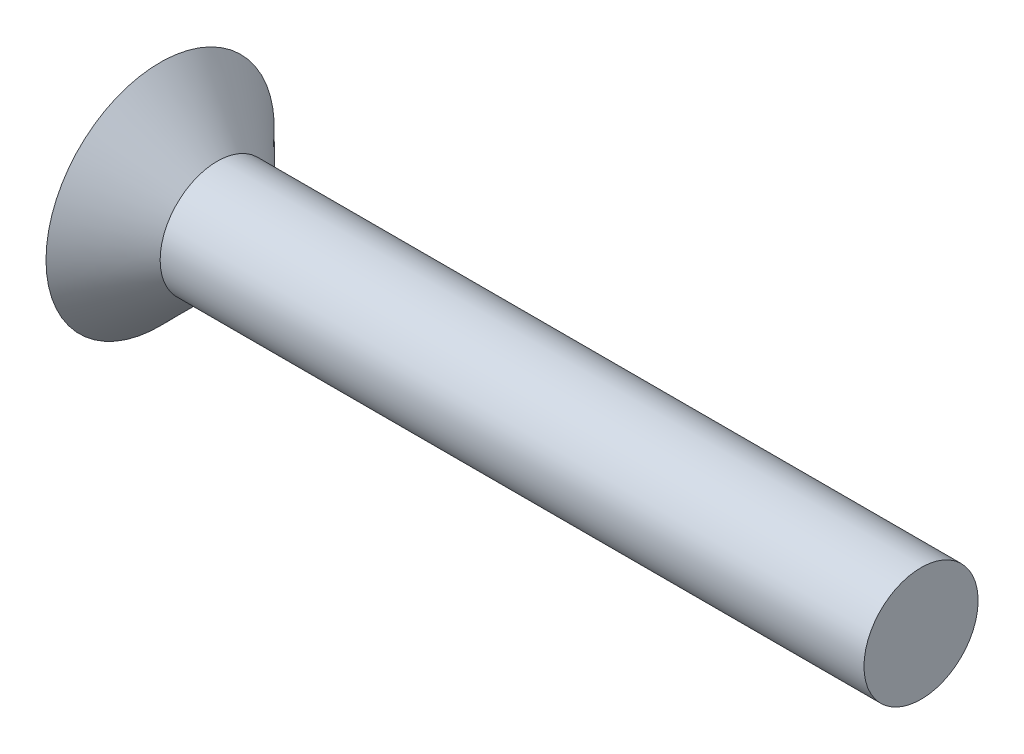
ISO-10303-21;
HEADER;
FILE_DESCRIPTION(('STEP AP214'),'2;1');
FILE_NAME('part.step','',(''),(''),'','','');
FILE_SCHEMA(('AUTOMOTIVE_DESIGN { 1 0 10303 214 1 1 1 1 }'));
ENDSEC;
DATA;
#1=APPLICATION_CONTEXT('core data for automotive mechanical design processes');
#2=APPLICATION_PROTOCOL_DEFINITION('international standard','automotive_design',2000,#1);
#3=PRODUCT_CONTEXT('',#1,'mechanical');
#4=PRODUCT('Part','Part','',(#3));
#5=PRODUCT_RELATED_PRODUCT_CATEGORY('part','',(#4));
#6=PRODUCT_DEFINITION_FORMATION('','',#4);
#7=PRODUCT_DEFINITION_CONTEXT('part definition',#1,'design');
#8=PRODUCT_DEFINITION('design','',#6,#7);
#9=PRODUCT_DEFINITION_SHAPE('','',#8);
#10=(LENGTH_UNIT() NAMED_UNIT(*) SI_UNIT(.MILLI.,.METRE.));
#11=(NAMED_UNIT(*) PLANE_ANGLE_UNIT() SI_UNIT($,.RADIAN.));
#12=(NAMED_UNIT(*) SI_UNIT($,.STERADIAN.) SOLID_ANGLE_UNIT());
#13=UNCERTAINTY_MEASURE_WITH_UNIT(LENGTH_MEASURE(1.E-05),#10,'distance_accuracy_value','');
#14=(GEOMETRIC_REPRESENTATION_CONTEXT(3) GLOBAL_UNCERTAINTY_ASSIGNED_CONTEXT((#13)) GLOBAL_UNIT_ASSIGNED_CONTEXT((#10,
#11,#12)) REPRESENTATION_CONTEXT('',''));
#15=CARTESIAN_POINT('',(0.,0.,0.));
#16=DIRECTION('',(0.,0.,1.));
#17=DIRECTION('',(1.,0.,0.));
#18=AXIS2_PLACEMENT_3D('',#15,#16,#17);
#19=CARTESIAN_POINT('',(0.,0.,0.));
#20=DIRECTION('',(-1.,0.,0.));
#21=DIRECTION('',(0.,0.,1.));
#22=AXIS2_PLACEMENT_3D('',#19,#20,#21);
#23=PLANE('',#22);
#24=DIRECTION('',(0.,0.5,-0.866025403784439));
#25=VECTOR('',#24,1.);
#26=CARTESIAN_POINT('',(0.,0.577350269189627,1.));
#27=LINE('',#26,#25);
#28=CARTESIAN_POINT('',(0.,0.577350269189627,1.));
#29=VERTEX_POINT('',#28);
#30=CARTESIAN_POINT('',(0.,1.15470053837925,0.));
#31=VERTEX_POINT('',#30);
#32=EDGE_CURVE('E54',#29,#31,#27,.T.);
#33=ORIENTED_EDGE('',*,*,#32,.F.);
#34=DIRECTION('',(0.,1.,0.));
#35=VECTOR('',#34,1.);
#36=CARTESIAN_POINT('',(0.,-0.577350269189627,1.));
#37=LINE('',#36,#35);
#38=CARTESIAN_POINT('',(0.,-0.577350269189627,1.));
#39=VERTEX_POINT('',#38);
#40=EDGE_CURVE('E137',#39,#29,#37,.T.);
#41=ORIENTED_EDGE('',*,*,#40,.F.);
#42=DIRECTION('',(0.,0.5,0.866025403784439));
#43=VECTOR('',#42,1.);
#44=CARTESIAN_POINT('',(0.,-1.15470053837925,0.));
#45=LINE('',#44,#43);
#46=CARTESIAN_POINT('',(0.,-1.15470053837925,0.));
#47=VERTEX_POINT('',#46);
#48=EDGE_CURVE('E135',#47,#39,#45,.T.);
#49=ORIENTED_EDGE('',*,*,#48,.F.);
#50=DIRECTION('',(0.,-0.5,0.866025403784438));
#51=VECTOR('',#50,1.);
#52=CARTESIAN_POINT('',(0.,-0.577350269189626,-1.));
#53=LINE('',#52,#51);
#54=CARTESIAN_POINT('',(0.,-0.577350269189626,-1.));
#55=VERTEX_POINT('',#54);
#56=EDGE_CURVE('E102',#55,#47,#53,.T.);
#57=ORIENTED_EDGE('',*,*,#56,.F.);
#58=DIRECTION('',(0.,-1.,0.));
#59=VECTOR('',#58,1.);
#60=CARTESIAN_POINT('',(0.,0.577350269189627,-1.));
#61=LINE('',#60,#59);
#62=CARTESIAN_POINT('',(0.,0.577350269189627,-1.));
#63=VERTEX_POINT('',#62);
#64=EDGE_CURVE('E131',#63,#55,#61,.T.);
#65=ORIENTED_EDGE('',*,*,#64,.F.);
#66=DIRECTION('',(0.,-0.5,-0.866025403784439));
#67=VECTOR('',#66,1.);
#68=CARTESIAN_POINT('',(0.,1.15470053837925,0.));
#69=LINE('',#68,#67);
#70=EDGE_CURVE('E128',#31,#63,#69,.T.);
#71=ORIENTED_EDGE('',*,*,#70,.F.);
#72=EDGE_LOOP('',(#33,#41,#49,#57,#65,#71));
#73=FACE_BOUND('',#72,.T.);
#74=CARTESIAN_POINT('',(0.,0.,0.));
#75=DIRECTION('',(-1.,0.,0.));
#76=DIRECTION('',(0.,0.,1.));
#77=AXIS2_PLACEMENT_3D('',#74,#75,#76);
#78=CIRCLE('',#77,3.);
#79=CARTESIAN_POINT('',(0.,0.,3.));
#80=VERTEX_POINT('',#79);
#81=EDGE_CURVE('E141',#80,#80,#78,.T.);
#82=ORIENTED_EDGE('',*,*,#81,.T.);
#83=EDGE_LOOP('',(#82));
#84=FACE_BOUND('',#83,.T.);
#85=ADVANCED_FACE('F40',(#73,#84),#23,.T.);
#86=CARTESIAN_POINT('',(20.,0.,0.));
#87=DIRECTION('',(-1.,0.,0.));
#88=DIRECTION('',(0.,0.,1.));
#89=AXIS2_PLACEMENT_3D('',#86,#87,#88);
#90=PLANE('',#89);
#91=CARTESIAN_POINT('',(20.,0.,0.));
#92=DIRECTION('',(-1.,0.,0.));
#93=DIRECTION('',(0.,0.,1.));
#94=AXIS2_PLACEMENT_3D('',#91,#92,#93);
#95=CIRCLE('',#94,1.5);
#96=CARTESIAN_POINT('',(20.,0.,1.5));
#97=VERTEX_POINT('',#96);
#98=EDGE_CURVE('E11',#97,#97,#95,.T.);
#99=ORIENTED_EDGE('',*,*,#98,.F.);
#100=EDGE_LOOP('',(#99));
#101=FACE_BOUND('',#100,.T.);
#102=ADVANCED_FACE('F156',(#101),#90,.F.);
#103=CARTESIAN_POINT('',(0.,0.,0.));
#104=DIRECTION('',(-1.,0.,0.));
#105=DIRECTION('',(0.,0.,1.));
#106=AXIS2_PLACEMENT_3D('',#103,#104,#105);
#107=CYLINDRICAL_SURFACE('',#106,1.5);
#108=CARTESIAN_POINT('',(1.50000000000001,0.,0.));
#109=DIRECTION('',(-1.,0.,0.));
#110=DIRECTION('',(0.,0.,1.));
#111=AXIS2_PLACEMENT_3D('',#108,#109,#110);
#112=CIRCLE('',#111,1.5);
#113=CARTESIAN_POINT('',(1.50000000000001,0.,1.5));
#114=VERTEX_POINT('',#113);
#115=EDGE_CURVE('E47',#114,#114,#112,.T.);
#116=ORIENTED_EDGE('',*,*,#115,.F.);
#117=EDGE_LOOP('',(#116));
#118=FACE_BOUND('',#117,.T.);
#119=ORIENTED_EDGE('',*,*,#98,.T.);
#120=EDGE_LOOP('',(#119));
#121=FACE_BOUND('',#120,.T.);
#122=ADVANCED_FACE('F153',(#118,#121),#107,.T.);
#123=CARTESIAN_POINT('',(1.50000000000001,0.,0.));
#124=DIRECTION('',(-1.,0.,0.));
#125=DIRECTION('',(0.,0.,1.));
#126=AXIS2_PLACEMENT_3D('',#123,#124,#125);
#127=CONICAL_SURFACE('',#126,1.5,0.785398163397446);
#128=ORIENTED_EDGE('',*,*,#81,.F.);
#129=EDGE_LOOP('',(#128));
#130=FACE_BOUND('',#129,.T.);
#131=ORIENTED_EDGE('',*,*,#115,.T.);
#132=EDGE_LOOP('',(#131));
#133=FACE_BOUND('',#132,.T.);
#134=ADVANCED_FACE('F151',(#130,#133),#127,.T.);
#135=CARTESIAN_POINT('',(1.,0.577350269189627,1.));
#136=DIRECTION('',(0.,0.866025403784439,0.5));
#137=DIRECTION('',(0.,-0.5,0.866025403784439));
#138=AXIS2_PLACEMENT_3D('',#135,#136,#137);
#139=PLANE('',#138);
#140=ORIENTED_EDGE('',*,*,#32,.T.);
#141=DIRECTION('',(-1.,0.,0.));
#142=VECTOR('',#141,1.);
#143=CARTESIAN_POINT('',(1.,1.15470053837925,0.));
#144=LINE('',#143,#142);
#145=CARTESIAN_POINT('',(1.,1.15470053837925,0.));
#146=VERTEX_POINT('',#145);
#147=EDGE_CURVE('E84',#146,#31,#144,.T.);
#148=ORIENTED_EDGE('',*,*,#147,.F.);
#149=DIRECTION('',(0.,0.5,-0.866025403784439));
#150=VECTOR('',#149,1.);
#151=CARTESIAN_POINT('',(1.,0.577350269189627,1.));
#152=LINE('',#151,#150);
#153=CARTESIAN_POINT('',(1.,0.577350269189627,1.));
#154=VERTEX_POINT('',#153);
#155=EDGE_CURVE('E139',#154,#146,#152,.T.);
#156=ORIENTED_EDGE('',*,*,#155,.F.);
#157=DIRECTION('',(-1.,0.,0.));
#158=VECTOR('',#157,1.);
#159=CARTESIAN_POINT('',(1.,0.577350269189627,1.));
#160=LINE('',#159,#158);
#161=EDGE_CURVE('E62',#154,#29,#160,.T.);
#162=ORIENTED_EDGE('',*,*,#161,.T.);
#163=EDGE_LOOP('',(#140,#148,#156,#162));
#164=FACE_BOUND('',#163,.T.);
#165=ADVANCED_FACE('F168',(#164),#139,.F.);
#166=CARTESIAN_POINT('',(1.,-0.577350269189627,1.));
#167=DIRECTION('',(0.,0.,1.));
#168=DIRECTION('',(0.,-1.,0.));
#169=AXIS2_PLACEMENT_3D('',#166,#167,#168);
#170=PLANE('',#169);
#171=ORIENTED_EDGE('',*,*,#40,.T.);
#172=ORIENTED_EDGE('',*,*,#161,.F.);
#173=DIRECTION('',(0.,1.,0.));
#174=VECTOR('',#173,1.);
#175=CARTESIAN_POINT('',(1.,-0.577350269189627,1.));
#176=LINE('',#175,#174);
#177=CARTESIAN_POINT('',(1.,-0.577350269189627,1.));
#178=VERTEX_POINT('',#177);
#179=EDGE_CURVE('E114',#178,#154,#176,.T.);
#180=ORIENTED_EDGE('',*,*,#179,.F.);
#181=DIRECTION('',(-1.,0.,0.));
#182=VECTOR('',#181,1.);
#183=CARTESIAN_POINT('',(1.,-0.577350269189627,1.));
#184=LINE('',#183,#182);
#185=EDGE_CURVE('E106',#178,#39,#184,.T.);
#186=ORIENTED_EDGE('',*,*,#185,.T.);
#187=EDGE_LOOP('',(#171,#172,#180,#186));
#188=FACE_BOUND('',#187,.T.);
#189=ADVANCED_FACE('F172',(#188),#170,.F.);
#190=CARTESIAN_POINT('',(1.,-1.15470053837925,0.));
#191=DIRECTION('',(0.,-0.866025403784439,0.5));
#192=DIRECTION('',(0.,-0.5,-0.866025403784439));
#193=AXIS2_PLACEMENT_3D('',#190,#191,#192);
#194=PLANE('',#193);
#195=ORIENTED_EDGE('',*,*,#48,.T.);
#196=ORIENTED_EDGE('',*,*,#185,.F.);
#197=DIRECTION('',(0.,0.5,0.866025403784439));
#198=VECTOR('',#197,1.);
#199=CARTESIAN_POINT('',(1.,-1.15470053837925,0.));
#200=LINE('',#199,#198);
#201=CARTESIAN_POINT('',(1.,-1.15470053837925,0.));
#202=VERTEX_POINT('',#201);
#203=EDGE_CURVE('E110',#202,#178,#200,.T.);
#204=ORIENTED_EDGE('',*,*,#203,.F.);
#205=DIRECTION('',(-1.,0.,0.));
#206=VECTOR('',#205,1.);
#207=CARTESIAN_POINT('',(1.,-1.15470053837925,0.));
#208=LINE('',#207,#206);
#209=EDGE_CURVE('E95',#202,#47,#208,.T.);
#210=ORIENTED_EDGE('',*,*,#209,.T.);
#211=EDGE_LOOP('',(#195,#196,#204,#210));
#212=FACE_BOUND('',#211,.T.);
#213=ADVANCED_FACE('F111',(#212),#194,.F.);
#214=CARTESIAN_POINT('',(1.,-0.577350269189626,-1.));
#215=DIRECTION('',(0.,-0.866025403784438,-0.5));
#216=DIRECTION('',(0.,0.5,-0.866025403784438));
#217=AXIS2_PLACEMENT_3D('',#214,#215,#216);
#218=PLANE('',#217);
#219=ORIENTED_EDGE('',*,*,#56,.T.);
#220=ORIENTED_EDGE('',*,*,#209,.F.);
#221=DIRECTION('',(0.,-0.5,0.866025403784438));
#222=VECTOR('',#221,1.);
#223=CARTESIAN_POINT('',(1.,-0.577350269189626,-1.));
#224=LINE('',#223,#222);
#225=CARTESIAN_POINT('',(1.,-0.577350269189626,-1.));
#226=VERTEX_POINT('',#225);
#227=EDGE_CURVE('E99',#226,#202,#224,.T.);
#228=ORIENTED_EDGE('',*,*,#227,.F.);
#229=DIRECTION('',(-1.,0.,0.));
#230=VECTOR('',#229,1.);
#231=CARTESIAN_POINT('',(1.,-0.577350269189626,-1.));
#232=LINE('',#231,#230);
#233=EDGE_CURVE('E107',#226,#55,#232,.T.);
#234=ORIENTED_EDGE('',*,*,#233,.T.);
#235=EDGE_LOOP('',(#219,#220,#228,#234));
#236=FACE_BOUND('',#235,.T.);
#237=ADVANCED_FACE('F97',(#236),#218,.F.);
#238=CARTESIAN_POINT('',(1.,0.577350269189627,-1.));
#239=DIRECTION('',(0.,0.,-1.));
#240=DIRECTION('',(-1.,0.,0.));
#241=AXIS2_PLACEMENT_3D('',#238,#239,#240);
#242=PLANE('',#241);
#243=ORIENTED_EDGE('',*,*,#64,.T.);
#244=ORIENTED_EDGE('',*,*,#233,.F.);
#245=DIRECTION('',(0.,-1.,0.));
#246=VECTOR('',#245,1.);
#247=CARTESIAN_POINT('',(1.,0.577350269189627,-1.));
#248=LINE('',#247,#246);
#249=CARTESIAN_POINT('',(1.,0.577350269189627,-1.));
#250=VERTEX_POINT('',#249);
#251=EDGE_CURVE('E120',#250,#226,#248,.T.);
#252=ORIENTED_EDGE('',*,*,#251,.F.);
#253=DIRECTION('',(-1.,0.,0.));
#254=VECTOR('',#253,1.);
#255=CARTESIAN_POINT('',(1.,0.577350269189627,-1.));
#256=LINE('',#255,#254);
#257=EDGE_CURVE('E144',#250,#63,#256,.T.);
#258=ORIENTED_EDGE('',*,*,#257,.T.);
#259=EDGE_LOOP('',(#243,#244,#252,#258));
#260=FACE_BOUND('',#259,.T.);
#261=ADVANCED_FACE('F176',(#260),#242,.F.);
#262=CARTESIAN_POINT('',(1.,1.15470053837925,0.));
#263=DIRECTION('',(0.,0.866025403784439,-0.5));
#264=DIRECTION('',(0.,0.5,0.866025403784439));
#265=AXIS2_PLACEMENT_3D('',#262,#263,#264);
#266=PLANE('',#265);
#267=ORIENTED_EDGE('',*,*,#70,.T.);
#268=ORIENTED_EDGE('',*,*,#257,.F.);
#269=DIRECTION('',(0.,-0.5,-0.866025403784439));
#270=VECTOR('',#269,1.);
#271=CARTESIAN_POINT('',(1.,1.15470053837925,0.));
#272=LINE('',#271,#270);
#273=EDGE_CURVE('E122',#146,#250,#272,.T.);
#274=ORIENTED_EDGE('',*,*,#273,.F.);
#275=ORIENTED_EDGE('',*,*,#147,.T.);
#276=EDGE_LOOP('',(#267,#268,#274,#275));
#277=FACE_BOUND('',#276,.T.);
#278=ADVANCED_FACE('F173',(#277),#266,.F.);
#279=CARTESIAN_POINT('',(1.,0.,0.));
#280=DIRECTION('',(-1.,0.,0.));
#281=DIRECTION('',(0.,0.,1.));
#282=AXIS2_PLACEMENT_3D('',#279,#280,#281);
#283=PLANE('',#282);
#284=ORIENTED_EDGE('',*,*,#155,.T.);
#285=ORIENTED_EDGE('',*,*,#273,.T.);
#286=ORIENTED_EDGE('',*,*,#251,.T.);
#287=ORIENTED_EDGE('',*,*,#227,.T.);
#288=ORIENTED_EDGE('',*,*,#203,.T.);
#289=ORIENTED_EDGE('',*,*,#179,.T.);
#290=EDGE_LOOP('',(#284,#285,#286,#287,#288,#289));
#291=FACE_BOUND('',#290,.T.);
#292=ADVANCED_FACE('F117',(#291),#283,.T.);
#293=CLOSED_SHELL('',(#85,#102,#122,#134,#165,#189,#213,#237,#261,#278,#292));
#294=MANIFOLD_SOLID_BREP('B2',#293);
#295=ADVANCED_BREP_SHAPE_REPRESENTATION('',(#18,#294),#14);
#296=SHAPE_DEFINITION_REPRESENTATION(#9,#295);
ENDSEC;
END-ISO-10303-21;
